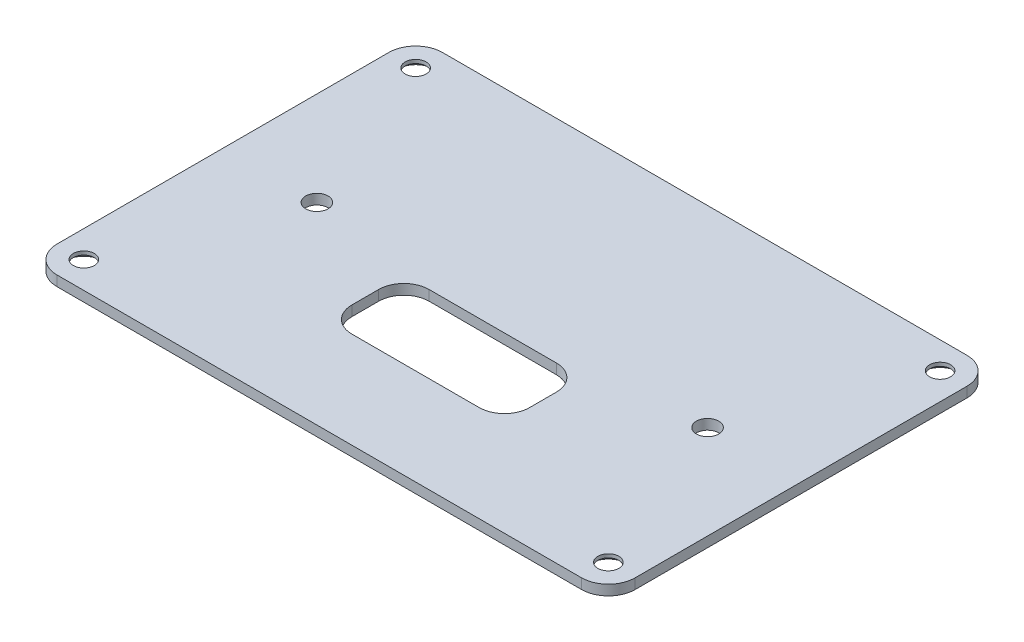
ISO-10303-21;
HEADER;
FILE_DESCRIPTION(('STEP AP214'),'2;1');
FILE_NAME('part.step','',(''),(''),'','','');
FILE_SCHEMA(('AUTOMOTIVE_DESIGN { 1 0 10303 214 1 1 1 1 }'));
ENDSEC;
DATA;
#1=APPLICATION_CONTEXT('core data for automotive mechanical design processes');
#2=APPLICATION_PROTOCOL_DEFINITION('international standard','automotive_design',2000,#1);
#3=PRODUCT_CONTEXT('',#1,'mechanical');
#4=PRODUCT('Part','Part','',(#3));
#5=PRODUCT_RELATED_PRODUCT_CATEGORY('part','',(#4));
#6=PRODUCT_DEFINITION_FORMATION('','',#4);
#7=PRODUCT_DEFINITION_CONTEXT('part definition',#1,'design');
#8=PRODUCT_DEFINITION('design','',#6,#7);
#9=PRODUCT_DEFINITION_SHAPE('','',#8);
#10=(LENGTH_UNIT() NAMED_UNIT(*) SI_UNIT(.MILLI.,.METRE.));
#11=(NAMED_UNIT(*) PLANE_ANGLE_UNIT() SI_UNIT($,.RADIAN.));
#12=(NAMED_UNIT(*) SI_UNIT($,.STERADIAN.) SOLID_ANGLE_UNIT());
#13=UNCERTAINTY_MEASURE_WITH_UNIT(LENGTH_MEASURE(1.E-05),#10,'distance_accuracy_value','');
#14=(GEOMETRIC_REPRESENTATION_CONTEXT(3) GLOBAL_UNCERTAINTY_ASSIGNED_CONTEXT((#13)) GLOBAL_UNIT_ASSIGNED_CONTEXT((#10,
#11,#12)) REPRESENTATION_CONTEXT('',''));
#15=CARTESIAN_POINT('',(0.,0.,0.));
#16=DIRECTION('',(0.,0.,1.));
#17=DIRECTION('',(1.,0.,0.));
#18=AXIS2_PLACEMENT_3D('',#15,#16,#17);
#19=CARTESIAN_POINT('',(-40.8250000000001,0.,-25.8250000000001));
#20=DIRECTION('',(0.,1.,0.));
#21=DIRECTION('',(0.,0.,1.));
#22=AXIS2_PLACEMENT_3D('',#19,#20,#21);
#23=PLANE('',#22);
#24=CARTESIAN_POINT('',(30.382,0.,-0.0614872263166575));
#25=DIRECTION('',(0.,-1.,0.));
#26=DIRECTION('',(0.,0.,-1.));
#27=AXIS2_PLACEMENT_3D('',#24,#25,#26);
#28=CIRCLE('',#27,1.7399);
#29=CARTESIAN_POINT('',(30.382,0.,-1.80138722631666));
#30=VERTEX_POINT('',#29);
#31=EDGE_CURVE('E568',#30,#30,#28,.T.);
#32=ORIENTED_EDGE('',*,*,#31,.F.);
#33=EDGE_LOOP('',(#32));
#34=FACE_BOUND('',#33,.T.);
#35=CARTESIAN_POINT('',(-30.3819999999999,0.,-0.00901752783329521));
#36=DIRECTION('',(0.,-1.,0.));
#37=DIRECTION('',(0.,0.,-1.));
#38=AXIS2_PLACEMENT_3D('',#35,#36,#37);
#39=CIRCLE('',#38,1.7399);
#40=CARTESIAN_POINT('',(-30.3819999999999,0.,-1.7489175278333));
#41=VERTEX_POINT('',#40);
#42=EDGE_CURVE('E570',#41,#41,#39,.T.);
#43=ORIENTED_EDGE('',*,*,#42,.F.);
#44=EDGE_LOOP('',(#43));
#45=FACE_BOUND('',#44,.T.);
#46=CARTESIAN_POINT('',(-40.8250000000001,0.,-25.8250000000001));
#47=DIRECTION('',(0.,-1.,0.));
#48=DIRECTION('',(0.,0.,-1.));
#49=AXIS2_PLACEMENT_3D('',#46,#47,#48);
#50=CIRCLE('',#49,2.8575);
#51=CARTESIAN_POINT('',(-40.8250000000001,0.,-28.6825000000001));
#52=VERTEX_POINT('',#51);
#53=EDGE_CURVE('E587',#52,#52,#50,.T.);
#54=ORIENTED_EDGE('',*,*,#53,.F.);
#55=EDGE_LOOP('',(#54));
#56=FACE_BOUND('',#55,.T.);
#57=CARTESIAN_POINT('',(-40.8250000000001,0.,-25.8250000000001));
#58=DIRECTION('',(0.,1.,0.));
#59=DIRECTION('',(0.,0.,1.));
#60=AXIS2_PLACEMENT_3D('',#57,#58,#59);
#61=CIRCLE('',#60,4.17499999999999);
#62=CARTESIAN_POINT('',(-40.8250000000001,0.,-30.0000000000001));
#63=VERTEX_POINT('',#62);
#64=CARTESIAN_POINT('',(-45.0000000000001,0.,-25.8250000000001));
#65=VERTEX_POINT('',#64);
#66=EDGE_CURVE('E367',#63,#65,#61,.T.);
#67=ORIENTED_EDGE('',*,*,#66,.F.);
#68=DIRECTION('',(-1.,0.,0.));
#69=VECTOR('',#68,1.);
#70=CARTESIAN_POINT('',(-40.8250000000001,0.,-30.0000000000001));
#71=LINE('',#70,#69);
#72=CARTESIAN_POINT('',(40.8250000000001,0.,-30.0000000000001));
#73=VERTEX_POINT('',#72);
#74=EDGE_CURVE('E383',#73,#63,#71,.T.);
#75=ORIENTED_EDGE('',*,*,#74,.F.);
#76=CARTESIAN_POINT('',(40.8250000000001,0.,-25.8250000000001));
#77=DIRECTION('',(0.,1.,0.));
#78=DIRECTION('',(0.,0.,1.));
#79=AXIS2_PLACEMENT_3D('',#76,#77,#78);
#80=CIRCLE('',#79,4.175);
#81=CARTESIAN_POINT('',(45.0000000000001,0.,-25.8250000000001));
#82=VERTEX_POINT('',#81);
#83=EDGE_CURVE('E410',#82,#73,#80,.T.);
#84=ORIENTED_EDGE('',*,*,#83,.F.);
#85=DIRECTION('',(0.,0.,-1.));
#86=VECTOR('',#85,1.);
#87=CARTESIAN_POINT('',(45.0000000000001,0.,-25.8250000000001));
#88=LINE('',#87,#86);
#89=CARTESIAN_POINT('',(45.0000000000001,0.,25.8250000000001));
#90=VERTEX_POINT('',#89);
#91=EDGE_CURVE('E408',#90,#82,#88,.T.);
#92=ORIENTED_EDGE('',*,*,#91,.F.);
#93=CARTESIAN_POINT('',(40.8250000000001,0.,25.8250000000001));
#94=DIRECTION('',(0.,1.,0.));
#95=DIRECTION('',(0.,0.,1.));
#96=AXIS2_PLACEMENT_3D('',#93,#94,#95);
#97=CIRCLE('',#96,4.17499999999999);
#98=CARTESIAN_POINT('',(40.8250000000001,0.,30.0000000000001));
#99=VERTEX_POINT('',#98);
#100=EDGE_CURVE('E406',#99,#90,#97,.T.);
#101=ORIENTED_EDGE('',*,*,#100,.F.);
#102=DIRECTION('',(1.,0.,0.));
#103=VECTOR('',#102,1.);
#104=CARTESIAN_POINT('',(-40.8250000000001,0.,30.0000000000001));
#105=LINE('',#104,#103);
#106=CARTESIAN_POINT('',(-40.8250000000001,0.,30.0000000000001));
#107=VERTEX_POINT('',#106);
#108=EDGE_CURVE('E404',#107,#99,#105,.T.);
#109=ORIENTED_EDGE('',*,*,#108,.F.);
#110=CARTESIAN_POINT('',(-40.8250000000001,0.,25.8250000000001));
#111=DIRECTION('',(0.,1.,0.));
#112=DIRECTION('',(0.,0.,1.));
#113=AXIS2_PLACEMENT_3D('',#110,#111,#112);
#114=CIRCLE('',#113,4.17500000000001);
#115=CARTESIAN_POINT('',(-45.0000000000001,0.,25.8250000000001));
#116=VERTEX_POINT('',#115);
#117=EDGE_CURVE('E402',#116,#107,#114,.T.);
#118=ORIENTED_EDGE('',*,*,#117,.F.);
#119=DIRECTION('',(0.,0.,1.));
#120=VECTOR('',#119,1.);
#121=CARTESIAN_POINT('',(-45.0000000000001,0.,-25.8250000000001));
#122=LINE('',#121,#120);
#123=EDGE_CURVE('E400',#65,#116,#122,.T.);
#124=ORIENTED_EDGE('',*,*,#123,.F.);
#125=EDGE_LOOP('',(#67,#75,#84,#92,#101,#109,#118,#124));
#126=FACE_BOUND('',#125,.T.);
#127=DIRECTION('',(1.,0.,0.));
#128=VECTOR('',#127,1.);
#129=CARTESIAN_POINT('',(-9.90599999792557,0.,2.99561449189324));
#130=LINE('',#129,#128);
#131=CARTESIAN_POINT('',(-9.90599999792557,0.,2.99561449189324));
#132=VERTEX_POINT('',#131);
#133=CARTESIAN_POINT('',(9.9059999999467,0.,2.9956144918925));
#134=VERTEX_POINT('',#133);
#135=EDGE_CURVE('E349',#132,#134,#130,.T.);
#136=ORIENTED_EDGE('',*,*,#135,.F.);
#137=CARTESIAN_POINT('',(-9.90600000000007,0.,6.92461449189326));
#138=DIRECTION('',(0.,-1.,0.));
#139=DIRECTION('',(0.,0.,-1.));
#140=AXIS2_PLACEMENT_3D('',#137,#138,#139);
#141=CIRCLE('',#140,3.929);
#142=CARTESIAN_POINT('',(-13.8350000000001,0.,6.92461449288326));
#143=VERTEX_POINT('',#142);
#144=EDGE_CURVE('E67',#143,#132,#141,.T.);
#145=ORIENTED_EDGE('',*,*,#144,.F.);
#146=DIRECTION('',(0.,0.,-1.));
#147=VECTOR('',#146,1.);
#148=CARTESIAN_POINT('',(-13.8350000000001,0.,6.92461449288326));
#149=LINE('',#148,#147);
#150=CARTESIAN_POINT('',(-13.8350000000001,0.,11.0902144916973));
#151=VERTEX_POINT('',#150);
#152=EDGE_CURVE('E176',#151,#143,#149,.T.);
#153=ORIENTED_EDGE('',*,*,#152,.F.);
#154=CARTESIAN_POINT('',(-9.90600000000007,0.,11.0902144918933));
#155=DIRECTION('',(0.,-1.,0.));
#156=DIRECTION('',(0.,0.,-1.));
#157=AXIS2_PLACEMENT_3D('',#154,#155,#156);
#158=CIRCLE('',#157,3.929);
#159=CARTESIAN_POINT('',(-9.90599999794791,0.,15.0192144918933));
#160=VERTEX_POINT('',#159);
#161=EDGE_CURVE('E179',#160,#151,#158,.T.);
#162=ORIENTED_EDGE('',*,*,#161,.F.);
#163=DIRECTION('',(-1.,0.,0.));
#164=VECTOR('',#163,1.);
#165=CARTESIAN_POINT('',(-9.90599999794791,0.,15.0192144918933));
#166=LINE('',#165,#164);
#167=CARTESIAN_POINT('',(9.905999999399,0.,15.0192144918933));
#168=VERTEX_POINT('',#167);
#169=EDGE_CURVE('E360',#168,#160,#166,.T.);
#170=ORIENTED_EDGE('',*,*,#169,.F.);
#171=CARTESIAN_POINT('',(9.90599999999999,0.,11.0902144918933));
#172=DIRECTION('',(0.,-1.,0.));
#173=DIRECTION('',(0.,0.,-1.));
#174=AXIS2_PLACEMENT_3D('',#171,#172,#173);
#175=CIRCLE('',#174,3.929);
#176=CARTESIAN_POINT('',(13.835,0.,11.0902144920402));
#177=VERTEX_POINT('',#176);
#178=EDGE_CURVE('E357',#177,#168,#175,.T.);
#179=ORIENTED_EDGE('',*,*,#178,.F.);
#180=DIRECTION('',(0.,0.,1.));
#181=VECTOR('',#180,1.);
#182=CARTESIAN_POINT('',(13.835,0.,6.9246144920885));
#183=LINE('',#182,#181);
#184=CARTESIAN_POINT('',(13.835,0.,6.9246144920885));
#185=VERTEX_POINT('',#184);
#186=EDGE_CURVE('E354',#185,#177,#183,.T.);
#187=ORIENTED_EDGE('',*,*,#186,.F.);
#188=CARTESIAN_POINT('',(9.90599999999999,0.,6.92461449189325));
#189=DIRECTION('',(0.,-1.,0.));
#190=DIRECTION('',(0.,0.,-1.));
#191=AXIS2_PLACEMENT_3D('',#188,#189,#190);
#192=CIRCLE('',#191,3.92900000000074);
#193=EDGE_CURVE('E351',#134,#185,#192,.T.);
#194=ORIENTED_EDGE('',*,*,#193,.F.);
#195=EDGE_LOOP('',(#136,#145,#153,#162,#170,#179,#187,#194));
#196=FACE_BOUND('',#195,.T.);
#197=CARTESIAN_POINT('',(40.8250000000001,0.,-25.8250000000001));
#198=DIRECTION('',(0.,-1.,0.));
#199=DIRECTION('',(0.,0.,-1.));
#200=AXIS2_PLACEMENT_3D('',#197,#198,#199);
#201=CIRCLE('',#200,2.8575);
#202=CARTESIAN_POINT('',(40.8250000000001,0.,-28.6825000000001));
#203=VERTEX_POINT('',#202);
#204=EDGE_CURVE('E605',#203,#203,#201,.T.);
#205=ORIENTED_EDGE('',*,*,#204,.F.);
#206=EDGE_LOOP('',(#205));
#207=FACE_BOUND('',#206,.T.);
#208=CARTESIAN_POINT('',(40.8250000000001,0.,25.8250000000001));
#209=DIRECTION('',(0.,-1.,0.));
#210=DIRECTION('',(0.,0.,-1.));
#211=AXIS2_PLACEMENT_3D('',#208,#209,#210);
#212=CIRCLE('',#211,2.8575);
#213=CARTESIAN_POINT('',(40.8250000000001,0.,22.9675000000001));
#214=VERTEX_POINT('',#213);
#215=EDGE_CURVE('E596',#214,#214,#212,.T.);
#216=ORIENTED_EDGE('',*,*,#215,.F.);
#217=EDGE_LOOP('',(#216));
#218=FACE_BOUND('',#217,.T.);
#219=CARTESIAN_POINT('',(-40.8250000000001,0.,25.8250000000001));
#220=DIRECTION('',(0.,-1.,0.));
#221=DIRECTION('',(0.,0.,-1.));
#222=AXIS2_PLACEMENT_3D('',#219,#220,#221);
#223=CIRCLE('',#222,2.8575);
#224=CARTESIAN_POINT('',(-40.8250000000001,0.,22.9675000000001));
#225=VERTEX_POINT('',#224);
#226=EDGE_CURVE('E576',#225,#225,#223,.T.);
#227=ORIENTED_EDGE('',*,*,#226,.F.);
#228=EDGE_LOOP('',(#227));
#229=FACE_BOUND('',#228,.T.);
#230=ADVANCED_FACE('F44',(#34,#45,#56,#126,#196,#207,#218,#229),#23,.F.);
#231=CARTESIAN_POINT('',(-40.8250000000001,1.5875,-25.8250000000001));
#232=DIRECTION('',(0.,1.,0.));
#233=DIRECTION('',(0.,0.,1.));
#234=AXIS2_PLACEMENT_3D('',#231,#232,#233);
#235=PLANE('',#234);
#236=CARTESIAN_POINT('',(30.382,1.5875,-0.0614872263166575));
#237=DIRECTION('',(0.,-1.,0.));
#238=DIRECTION('',(0.,0.,-1.));
#239=AXIS2_PLACEMENT_3D('',#236,#237,#238);
#240=CIRCLE('',#239,1.7399);
#241=CARTESIAN_POINT('',(30.382,1.5875,-1.80138722631666));
#242=VERTEX_POINT('',#241);
#243=EDGE_CURVE('E566',#242,#242,#240,.T.);
#244=ORIENTED_EDGE('',*,*,#243,.T.);
#245=EDGE_LOOP('',(#244));
#246=FACE_BOUND('',#245,.T.);
#247=CARTESIAN_POINT('',(-30.3819999999999,1.5875,-0.00901752783329521));
#248=DIRECTION('',(0.,-1.,0.));
#249=DIRECTION('',(0.,0.,-1.));
#250=AXIS2_PLACEMENT_3D('',#247,#248,#249);
#251=CIRCLE('',#250,1.7399);
#252=CARTESIAN_POINT('',(-30.3819999999999,1.5875,-1.7489175278333));
#253=VERTEX_POINT('',#252);
#254=EDGE_CURVE('E573',#253,#253,#251,.T.);
#255=ORIENTED_EDGE('',*,*,#254,.T.);
#256=EDGE_LOOP('',(#255));
#257=FACE_BOUND('',#256,.T.);
#258=CARTESIAN_POINT('',(-40.8250000000001,1.5875,-25.8250000000001));
#259=DIRECTION('',(0.,-1.,0.));
#260=DIRECTION('',(0.,0.,-1.));
#261=AXIS2_PLACEMENT_3D('',#258,#259,#260);
#262=CIRCLE('',#261,1.63195);
#263=CARTESIAN_POINT('',(-40.8250000000001,1.5875,-27.4569500000001));
#264=VERTEX_POINT('',#263);
#265=EDGE_CURVE('E593',#264,#264,#262,.T.);
#266=ORIENTED_EDGE('',*,*,#265,.T.);
#267=EDGE_LOOP('',(#266));
#268=FACE_BOUND('',#267,.T.);
#269=CARTESIAN_POINT('',(40.8250000000001,1.5875,-25.8250000000001));
#270=DIRECTION('',(0.,-1.,0.));
#271=DIRECTION('',(0.,0.,-1.));
#272=AXIS2_PLACEMENT_3D('',#269,#270,#271);
#273=CIRCLE('',#272,1.63195);
#274=CARTESIAN_POINT('',(40.8250000000001,1.5875,-27.4569500000001));
#275=VERTEX_POINT('',#274);
#276=EDGE_CURVE('E182',#275,#275,#273,.T.);
#277=ORIENTED_EDGE('',*,*,#276,.T.);
#278=EDGE_LOOP('',(#277));
#279=FACE_BOUND('',#278,.T.);
#280=CARTESIAN_POINT('',(-9.90600000000007,1.5875,6.92461449189326));
#281=DIRECTION('',(0.,-1.,0.));
#282=DIRECTION('',(0.,0.,-1.));
#283=AXIS2_PLACEMENT_3D('',#280,#281,#282);
#284=CIRCLE('',#283,3.929);
#285=CARTESIAN_POINT('',(-13.8350000000001,1.5875,6.92461449288326));
#286=VERTEX_POINT('',#285);
#287=CARTESIAN_POINT('',(-9.90599999792557,1.5875,2.99561449189324));
#288=VERTEX_POINT('',#287);
#289=EDGE_CURVE('E159',#286,#288,#284,.T.);
#290=ORIENTED_EDGE('',*,*,#289,.T.);
#291=DIRECTION('',(1.,0.,0.));
#292=VECTOR('',#291,1.);
#293=CARTESIAN_POINT('',(-9.90599999792557,1.5875,2.99561449189324));
#294=LINE('',#293,#292);
#295=CARTESIAN_POINT('',(9.9059999999467,1.5875,2.99561449189176));
#296=VERTEX_POINT('',#295);
#297=EDGE_CURVE('E168',#288,#296,#294,.T.);
#298=ORIENTED_EDGE('',*,*,#297,.T.);
#299=CARTESIAN_POINT('',(9.90599999999999,1.5875,6.92461449189325));
#300=DIRECTION('',(0.,-1.,0.));
#301=DIRECTION('',(0.,0.,-1.));
#302=AXIS2_PLACEMENT_3D('',#299,#300,#301);
#303=CIRCLE('',#302,3.92900000000074);
#304=CARTESIAN_POINT('',(13.835,1.5875,6.9246144920885));
#305=VERTEX_POINT('',#304);
#306=EDGE_CURVE('E59',#296,#305,#303,.T.);
#307=ORIENTED_EDGE('',*,*,#306,.T.);
#308=DIRECTION('',(0.,0.,1.));
#309=VECTOR('',#308,1.);
#310=CARTESIAN_POINT('',(13.835,1.5875,6.9246144920885));
#311=LINE('',#310,#309);
#312=CARTESIAN_POINT('',(13.835,1.5875,11.0902144920402));
#313=VERTEX_POINT('',#312);
#314=EDGE_CURVE('E186',#305,#313,#311,.T.);
#315=ORIENTED_EDGE('',*,*,#314,.T.);
#316=CARTESIAN_POINT('',(9.90599999999999,1.5875,11.0902144918933));
#317=DIRECTION('',(0.,-1.,0.));
#318=DIRECTION('',(0.,0.,-1.));
#319=AXIS2_PLACEMENT_3D('',#316,#317,#318);
#320=CIRCLE('',#319,3.929);
#321=CARTESIAN_POINT('',(9.905999999399,1.5875,15.0192144918933));
#322=VERTEX_POINT('',#321);
#323=EDGE_CURVE('E190',#313,#322,#320,.T.);
#324=ORIENTED_EDGE('',*,*,#323,.T.);
#325=DIRECTION('',(-1.,0.,0.));
#326=VECTOR('',#325,1.);
#327=CARTESIAN_POINT('',(-9.90599999794791,1.5875,15.0192144918933));
#328=LINE('',#327,#326);
#329=CARTESIAN_POINT('',(-9.90599999794791,1.5875,15.0192144918933));
#330=VERTEX_POINT('',#329);
#331=EDGE_CURVE('E342',#322,#330,#328,.T.);
#332=ORIENTED_EDGE('',*,*,#331,.T.);
#333=CARTESIAN_POINT('',(-9.90600000000007,1.5875,11.0902144918933));
#334=DIRECTION('',(0.,-1.,0.));
#335=DIRECTION('',(0.,0.,-1.));
#336=AXIS2_PLACEMENT_3D('',#333,#334,#335);
#337=CIRCLE('',#336,3.929);
#338=CARTESIAN_POINT('',(-13.8350000000001,1.5875,11.0902144916973));
#339=VERTEX_POINT('',#338);
#340=EDGE_CURVE('E345',#330,#339,#337,.T.);
#341=ORIENTED_EDGE('',*,*,#340,.T.);
#342=DIRECTION('',(0.,0.,-1.));
#343=VECTOR('',#342,1.);
#344=CARTESIAN_POINT('',(-13.8350000000001,1.5875,6.92461449288326));
#345=LINE('',#344,#343);
#346=EDGE_CURVE('E165',#339,#286,#345,.T.);
#347=ORIENTED_EDGE('',*,*,#346,.T.);
#348=EDGE_LOOP('',(#290,#298,#307,#315,#324,#332,#341,#347));
#349=FACE_BOUND('',#348,.T.);
#350=CARTESIAN_POINT('',(-40.8250000000001,1.5875,-25.8250000000001));
#351=DIRECTION('',(0.,1.,0.));
#352=DIRECTION('',(0.,0.,1.));
#353=AXIS2_PLACEMENT_3D('',#350,#351,#352);
#354=CIRCLE('',#353,4.17499999999999);
#355=CARTESIAN_POINT('',(-40.8250000000001,1.5875,-30.0000000000001));
#356=VERTEX_POINT('',#355);
#357=CARTESIAN_POINT('',(-45.0000000000001,1.5875,-25.8250000000001));
#358=VERTEX_POINT('',#357);
#359=EDGE_CURVE('E379',#356,#358,#354,.T.);
#360=ORIENTED_EDGE('',*,*,#359,.T.);
#361=DIRECTION('',(0.,0.,1.));
#362=VECTOR('',#361,1.);
#363=CARTESIAN_POINT('',(-45.0000000000001,1.5875,-25.8250000000001));
#364=LINE('',#363,#362);
#365=CARTESIAN_POINT('',(-45.0000000000001,1.5875,25.8250000000001));
#366=VERTEX_POINT('',#365);
#367=EDGE_CURVE('E382',#358,#366,#364,.T.);
#368=ORIENTED_EDGE('',*,*,#367,.T.);
#369=CARTESIAN_POINT('',(-40.8250000000001,1.5875,25.8250000000001));
#370=DIRECTION('',(0.,1.,0.));
#371=DIRECTION('',(0.,0.,1.));
#372=AXIS2_PLACEMENT_3D('',#369,#370,#371);
#373=CIRCLE('',#372,4.17500000000001);
#374=CARTESIAN_POINT('',(-40.8250000000001,1.5875,30.0000000000001));
#375=VERTEX_POINT('',#374);
#376=EDGE_CURVE('E385',#366,#375,#373,.T.);
#377=ORIENTED_EDGE('',*,*,#376,.T.);
#378=DIRECTION('',(1.,0.,0.));
#379=VECTOR('',#378,1.);
#380=CARTESIAN_POINT('',(-40.8250000000001,1.5875,30.0000000000001));
#381=LINE('',#380,#379);
#382=CARTESIAN_POINT('',(40.8250000000001,1.5875,30.0000000000001));
#383=VERTEX_POINT('',#382);
#384=EDGE_CURVE('E387',#375,#383,#381,.T.);
#385=ORIENTED_EDGE('',*,*,#384,.T.);
#386=CARTESIAN_POINT('',(40.8250000000001,1.5875,25.8250000000001));
#387=DIRECTION('',(0.,1.,0.));
#388=DIRECTION('',(0.,0.,1.));
#389=AXIS2_PLACEMENT_3D('',#386,#387,#388);
#390=CIRCLE('',#389,4.17499999999999);
#391=CARTESIAN_POINT('',(45.0000000000001,1.5875,25.8250000000001));
#392=VERTEX_POINT('',#391);
#393=EDGE_CURVE('E389',#383,#392,#390,.T.);
#394=ORIENTED_EDGE('',*,*,#393,.T.);
#395=DIRECTION('',(0.,0.,-1.));
#396=VECTOR('',#395,1.);
#397=CARTESIAN_POINT('',(45.0000000000001,1.5875,-25.8250000000001));
#398=LINE('',#397,#396);
#399=CARTESIAN_POINT('',(45.0000000000001,1.5875,-25.8250000000001));
#400=VERTEX_POINT('',#399);
#401=EDGE_CURVE('E391',#392,#400,#398,.T.);
#402=ORIENTED_EDGE('',*,*,#401,.T.);
#403=CARTESIAN_POINT('',(40.8250000000001,1.5875,-25.8250000000001));
#404=DIRECTION('',(0.,1.,0.));
#405=DIRECTION('',(0.,0.,1.));
#406=AXIS2_PLACEMENT_3D('',#403,#404,#405);
#407=CIRCLE('',#406,4.175);
#408=CARTESIAN_POINT('',(40.8250000000001,1.5875,-30.0000000000001));
#409=VERTEX_POINT('',#408);
#410=EDGE_CURVE('E393',#400,#409,#407,.T.);
#411=ORIENTED_EDGE('',*,*,#410,.T.);
#412=DIRECTION('',(-1.,0.,0.));
#413=VECTOR('',#412,1.);
#414=CARTESIAN_POINT('',(-40.8250000000001,1.5875,-30.0000000000001));
#415=LINE('',#414,#413);
#416=EDGE_CURVE('E395',#409,#356,#415,.T.);
#417=ORIENTED_EDGE('',*,*,#416,.T.);
#418=EDGE_LOOP('',(#360,#368,#377,#385,#394,#402,#411,#417));
#419=FACE_BOUND('',#418,.T.);
#420=CARTESIAN_POINT('',(40.8250000000001,1.5875,25.8250000000001));
#421=DIRECTION('',(0.,-1.,0.));
#422=DIRECTION('',(0.,0.,-1.));
#423=AXIS2_PLACEMENT_3D('',#420,#421,#422);
#424=CIRCLE('',#423,1.63195);
#425=CARTESIAN_POINT('',(40.8250000000001,1.5875,24.1930500000001));
#426=VERTEX_POINT('',#425);
#427=EDGE_CURVE('E602',#426,#426,#424,.T.);
#428=ORIENTED_EDGE('',*,*,#427,.T.);
#429=EDGE_LOOP('',(#428));
#430=FACE_BOUND('',#429,.T.);
#431=CARTESIAN_POINT('',(-40.8250000000001,1.5875,25.8250000000001));
#432=DIRECTION('',(0.,-1.,0.));
#433=DIRECTION('',(0.,0.,-1.));
#434=AXIS2_PLACEMENT_3D('',#431,#432,#433);
#435=CIRCLE('',#434,1.63195);
#436=CARTESIAN_POINT('',(-40.8250000000001,1.5875,24.1930500000001));
#437=VERTEX_POINT('',#436);
#438=EDGE_CURVE('E584',#437,#437,#435,.T.);
#439=ORIENTED_EDGE('',*,*,#438,.T.);
#440=EDGE_LOOP('',(#439));
#441=FACE_BOUND('',#440,.T.);
#442=ADVANCED_FACE('F172',(#246,#257,#268,#279,#349,#419,#430,#441),#235,.T.);
#443=CARTESIAN_POINT('',(-40.8250000000001,1.5875,-25.8250000000001));
#444=DIRECTION('',(0.,-1.,0.));
#445=DIRECTION('',(0.,0.,-1.));
#446=AXIS2_PLACEMENT_3D('',#443,#444,#445);
#447=CYLINDRICAL_SURFACE('',#446,4.17499999999999);
#448=ORIENTED_EDGE('',*,*,#66,.T.);
#449=DIRECTION('',(0.,-1.,0.));
#450=VECTOR('',#449,1.);
#451=CARTESIAN_POINT('',(-45.0000000000001,1.5875,-25.8250000000001));
#452=LINE('',#451,#450);
#453=EDGE_CURVE('E13',#358,#65,#452,.T.);
#454=ORIENTED_EDGE('',*,*,#453,.F.);
#455=ORIENTED_EDGE('',*,*,#359,.F.);
#456=DIRECTION('',(0.,-1.,0.));
#457=VECTOR('',#456,1.);
#458=CARTESIAN_POINT('',(-40.8250000000001,1.5875,-30.0000000000001));
#459=LINE('',#458,#457);
#460=EDGE_CURVE('E397',#356,#63,#459,.T.);
#461=ORIENTED_EDGE('',*,*,#460,.T.);
#462=EDGE_LOOP('',(#448,#454,#455,#461));
#463=FACE_BOUND('',#462,.T.);
#464=ADVANCED_FACE('F46',(#463),#447,.T.);
#465=CARTESIAN_POINT('',(-45.0000000000001,1.5875,-25.8250000000001));
#466=DIRECTION('',(1.,0.,0.));
#467=DIRECTION('',(0.,0.,-1.));
#468=AXIS2_PLACEMENT_3D('',#465,#466,#467);
#469=PLANE('',#468);
#470=ORIENTED_EDGE('',*,*,#123,.T.);
#471=DIRECTION('',(0.,-1.,0.));
#472=VECTOR('',#471,1.);
#473=CARTESIAN_POINT('',(-45.0000000000001,1.5875,25.8250000000001));
#474=LINE('',#473,#472);
#475=EDGE_CURVE('E52',#366,#116,#474,.T.);
#476=ORIENTED_EDGE('',*,*,#475,.F.);
#477=ORIENTED_EDGE('',*,*,#367,.F.);
#478=ORIENTED_EDGE('',*,*,#453,.T.);
#479=EDGE_LOOP('',(#470,#476,#477,#478));
#480=FACE_BOUND('',#479,.T.);
#481=ADVANCED_FACE('F456',(#480),#469,.F.);
#482=CARTESIAN_POINT('',(-40.8250000000001,1.5875,25.8250000000001));
#483=DIRECTION('',(0.,-1.,0.));
#484=DIRECTION('',(0.,0.,-1.));
#485=AXIS2_PLACEMENT_3D('',#482,#483,#484);
#486=CYLINDRICAL_SURFACE('',#485,4.17500000000001);
#487=ORIENTED_EDGE('',*,*,#117,.T.);
#488=DIRECTION('',(0.,-1.,0.));
#489=VECTOR('',#488,1.);
#490=CARTESIAN_POINT('',(-40.8250000000001,1.5875,30.0000000000001));
#491=LINE('',#490,#489);
#492=EDGE_CURVE('E427',#375,#107,#491,.T.);
#493=ORIENTED_EDGE('',*,*,#492,.F.);
#494=ORIENTED_EDGE('',*,*,#376,.F.);
#495=ORIENTED_EDGE('',*,*,#475,.T.);
#496=EDGE_LOOP('',(#487,#493,#494,#495));
#497=FACE_BOUND('',#496,.T.);
#498=ADVANCED_FACE('F434',(#497),#486,.T.);
#499=CARTESIAN_POINT('',(-40.8250000000001,1.5875,30.0000000000001));
#500=DIRECTION('',(0.,0.,-1.));
#501=DIRECTION('',(-1.,0.,0.));
#502=AXIS2_PLACEMENT_3D('',#499,#500,#501);
#503=PLANE('',#502);
#504=ORIENTED_EDGE('',*,*,#108,.T.);
#505=DIRECTION('',(0.,-1.,0.));
#506=VECTOR('',#505,1.);
#507=CARTESIAN_POINT('',(40.8250000000001,1.5875,30.0000000000001));
#508=LINE('',#507,#506);
#509=EDGE_CURVE('E424',#383,#99,#508,.T.);
#510=ORIENTED_EDGE('',*,*,#509,.F.);
#511=ORIENTED_EDGE('',*,*,#384,.F.);
#512=ORIENTED_EDGE('',*,*,#492,.T.);
#513=EDGE_LOOP('',(#504,#510,#511,#512));
#514=FACE_BOUND('',#513,.T.);
#515=ADVANCED_FACE('F445',(#514),#503,.F.);
#516=CARTESIAN_POINT('',(40.8250000000001,1.5875,25.8250000000001));
#517=DIRECTION('',(0.,-1.,0.));
#518=DIRECTION('',(0.,0.,-1.));
#519=AXIS2_PLACEMENT_3D('',#516,#517,#518);
#520=CYLINDRICAL_SURFACE('',#519,4.17499999999999);
#521=ORIENTED_EDGE('',*,*,#100,.T.);
#522=DIRECTION('',(0.,-1.,0.));
#523=VECTOR('',#522,1.);
#524=CARTESIAN_POINT('',(45.0000000000001,1.5875,25.8250000000001));
#525=LINE('',#524,#523);
#526=EDGE_CURVE('E421',#392,#90,#525,.T.);
#527=ORIENTED_EDGE('',*,*,#526,.F.);
#528=ORIENTED_EDGE('',*,*,#393,.F.);
#529=ORIENTED_EDGE('',*,*,#509,.T.);
#530=EDGE_LOOP('',(#521,#527,#528,#529));
#531=FACE_BOUND('',#530,.T.);
#532=ADVANCED_FACE('F449',(#531),#520,.T.);
#533=CARTESIAN_POINT('',(45.0000000000001,1.5875,-25.8250000000001));
#534=DIRECTION('',(-1.,0.,0.));
#535=DIRECTION('',(0.,0.,1.));
#536=AXIS2_PLACEMENT_3D('',#533,#534,#535);
#537=PLANE('',#536);
#538=ORIENTED_EDGE('',*,*,#91,.T.);
#539=DIRECTION('',(0.,-1.,0.));
#540=VECTOR('',#539,1.);
#541=CARTESIAN_POINT('',(45.0000000000001,1.5875,-25.8250000000001));
#542=LINE('',#541,#540);
#543=EDGE_CURVE('E418',#400,#82,#542,.T.);
#544=ORIENTED_EDGE('',*,*,#543,.F.);
#545=ORIENTED_EDGE('',*,*,#401,.F.);
#546=ORIENTED_EDGE('',*,*,#526,.T.);
#547=EDGE_LOOP('',(#538,#544,#545,#546));
#548=FACE_BOUND('',#547,.T.);
#549=ADVANCED_FACE('F469',(#548),#537,.F.);
#550=CARTESIAN_POINT('',(40.8250000000001,1.5875,-25.8250000000001));
#551=DIRECTION('',(0.,-1.,0.));
#552=DIRECTION('',(0.,0.,-1.));
#553=AXIS2_PLACEMENT_3D('',#550,#551,#552);
#554=CYLINDRICAL_SURFACE('',#553,4.175);
#555=ORIENTED_EDGE('',*,*,#83,.T.);
#556=DIRECTION('',(0.,-1.,0.));
#557=VECTOR('',#556,1.);
#558=CARTESIAN_POINT('',(40.8250000000001,1.5875,-30.0000000000001));
#559=LINE('',#558,#557);
#560=EDGE_CURVE('E415',#409,#73,#559,.T.);
#561=ORIENTED_EDGE('',*,*,#560,.F.);
#562=ORIENTED_EDGE('',*,*,#410,.F.);
#563=ORIENTED_EDGE('',*,*,#543,.T.);
#564=EDGE_LOOP('',(#555,#561,#562,#563));
#565=FACE_BOUND('',#564,.T.);
#566=ADVANCED_FACE('F467',(#565),#554,.T.);
#567=CARTESIAN_POINT('',(-40.8250000000001,1.5875,-30.0000000000001));
#568=DIRECTION('',(0.,0.,1.));
#569=DIRECTION('',(1.,0.,0.));
#570=AXIS2_PLACEMENT_3D('',#567,#568,#569);
#571=PLANE('',#570);
#572=ORIENTED_EDGE('',*,*,#74,.T.);
#573=ORIENTED_EDGE('',*,*,#460,.F.);
#574=ORIENTED_EDGE('',*,*,#416,.F.);
#575=ORIENTED_EDGE('',*,*,#560,.T.);
#576=EDGE_LOOP('',(#572,#573,#574,#575));
#577=FACE_BOUND('',#576,.T.);
#578=ADVANCED_FACE('F462',(#577),#571,.F.);
#579=CARTESIAN_POINT('',(-9.90600000000007,1.5875,6.92461449189326));
#580=DIRECTION('',(0.,-1.,0.));
#581=DIRECTION('',(0.,0.,-1.));
#582=AXIS2_PLACEMENT_3D('',#579,#580,#581);
#583=CYLINDRICAL_SURFACE('',#582,3.929);
#584=ORIENTED_EDGE('',*,*,#144,.T.);
#585=DIRECTION('',(0.,-1.,0.));
#586=VECTOR('',#585,1.);
#587=CARTESIAN_POINT('',(-9.90599999792557,1.5875,2.99561449189324));
#588=LINE('',#587,#586);
#589=EDGE_CURVE('E155',#288,#132,#588,.T.);
#590=ORIENTED_EDGE('',*,*,#589,.F.);
#591=ORIENTED_EDGE('',*,*,#289,.F.);
#592=DIRECTION('',(0.,-1.,0.));
#593=VECTOR('',#592,1.);
#594=CARTESIAN_POINT('',(-13.8350000000001,1.5875,6.92461449288326));
#595=LINE('',#594,#593);
#596=EDGE_CURVE('E365',#286,#143,#595,.T.);
#597=ORIENTED_EDGE('',*,*,#596,.T.);
#598=EDGE_LOOP('',(#584,#590,#591,#597));
#599=FACE_BOUND('',#598,.T.);
#600=ADVANCED_FACE('F157',(#599),#583,.F.);
#601=CARTESIAN_POINT('',(-13.8350000000001,1.5875,6.92461449288326));
#602=DIRECTION('',(-1.,0.,0.));
#603=DIRECTION('',(0.,0.,1.));
#604=AXIS2_PLACEMENT_3D('',#601,#602,#603);
#605=PLANE('',#604);
#606=ORIENTED_EDGE('',*,*,#152,.T.);
#607=ORIENTED_EDGE('',*,*,#596,.F.);
#608=ORIENTED_EDGE('',*,*,#346,.F.);
#609=DIRECTION('',(0.,-1.,0.));
#610=VECTOR('',#609,1.);
#611=CARTESIAN_POINT('',(-13.8350000000001,1.5875,11.0902144916973));
#612=LINE('',#611,#610);
#613=EDGE_CURVE('E368',#339,#151,#612,.T.);
#614=ORIENTED_EDGE('',*,*,#613,.T.);
#615=EDGE_LOOP('',(#606,#607,#608,#614));
#616=FACE_BOUND('',#615,.T.);
#617=ADVANCED_FACE('F494',(#616),#605,.F.);
#618=CARTESIAN_POINT('',(-9.90600000000007,1.5875,11.0902144918933));
#619=DIRECTION('',(0.,-1.,0.));
#620=DIRECTION('',(0.,0.,-1.));
#621=AXIS2_PLACEMENT_3D('',#618,#619,#620);
#622=CYLINDRICAL_SURFACE('',#621,3.929);
#623=ORIENTED_EDGE('',*,*,#161,.T.);
#624=ORIENTED_EDGE('',*,*,#613,.F.);
#625=ORIENTED_EDGE('',*,*,#340,.F.);
#626=DIRECTION('',(0.,-1.,0.));
#627=VECTOR('',#626,1.);
#628=CARTESIAN_POINT('',(-9.90599999794791,1.5875,15.0192144918933));
#629=LINE('',#628,#627);
#630=EDGE_CURVE('E370',#330,#160,#629,.T.);
#631=ORIENTED_EDGE('',*,*,#630,.T.);
#632=EDGE_LOOP('',(#623,#624,#625,#631));
#633=FACE_BOUND('',#632,.T.);
#634=ADVANCED_FACE('F498',(#633),#622,.F.);
#635=CARTESIAN_POINT('',(-9.90599999794791,1.5875,15.0192144918933));
#636=DIRECTION('',(0.,0.,1.));
#637=DIRECTION('',(1.,0.,0.));
#638=AXIS2_PLACEMENT_3D('',#635,#636,#637);
#639=PLANE('',#638);
#640=ORIENTED_EDGE('',*,*,#169,.T.);
#641=ORIENTED_EDGE('',*,*,#630,.F.);
#642=ORIENTED_EDGE('',*,*,#331,.F.);
#643=DIRECTION('',(0.,-1.,0.));
#644=VECTOR('',#643,1.);
#645=CARTESIAN_POINT('',(9.905999999399,1.5875,15.0192144918933));
#646=LINE('',#645,#644);
#647=EDGE_CURVE('E372',#322,#168,#646,.T.);
#648=ORIENTED_EDGE('',*,*,#647,.T.);
#649=EDGE_LOOP('',(#640,#641,#642,#648));
#650=FACE_BOUND('',#649,.T.);
#651=ADVANCED_FACE('F515',(#650),#639,.F.);
#652=CARTESIAN_POINT('',(9.90599999999999,1.5875,11.0902144918933));
#653=DIRECTION('',(0.,-1.,0.));
#654=DIRECTION('',(0.,0.,-1.));
#655=AXIS2_PLACEMENT_3D('',#652,#653,#654);
#656=CYLINDRICAL_SURFACE('',#655,3.929);
#657=ORIENTED_EDGE('',*,*,#178,.T.);
#658=ORIENTED_EDGE('',*,*,#647,.F.);
#659=ORIENTED_EDGE('',*,*,#323,.F.);
#660=DIRECTION('',(0.,-1.,0.));
#661=VECTOR('',#660,1.);
#662=CARTESIAN_POINT('',(13.835,1.5875,11.0902144920402));
#663=LINE('',#662,#661);
#664=EDGE_CURVE('E374',#313,#177,#663,.T.);
#665=ORIENTED_EDGE('',*,*,#664,.T.);
#666=EDGE_LOOP('',(#657,#658,#659,#665));
#667=FACE_BOUND('',#666,.T.);
#668=ADVANCED_FACE('F511',(#667),#656,.F.);
#669=CARTESIAN_POINT('',(13.835,1.5875,6.9246144920885));
#670=DIRECTION('',(1.,0.,0.));
#671=DIRECTION('',(0.,0.,-1.));
#672=AXIS2_PLACEMENT_3D('',#669,#670,#671);
#673=PLANE('',#672);
#674=ORIENTED_EDGE('',*,*,#186,.T.);
#675=ORIENTED_EDGE('',*,*,#664,.F.);
#676=ORIENTED_EDGE('',*,*,#314,.F.);
#677=DIRECTION('',(0.,-1.,0.));
#678=VECTOR('',#677,1.);
#679=CARTESIAN_POINT('',(13.835,1.5875,6.9246144920885));
#680=LINE('',#679,#678);
#681=EDGE_CURVE('E376',#305,#185,#680,.T.);
#682=ORIENTED_EDGE('',*,*,#681,.T.);
#683=EDGE_LOOP('',(#674,#675,#676,#682));
#684=FACE_BOUND('',#683,.T.);
#685=ADVANCED_FACE('F508',(#684),#673,.F.);
#686=CARTESIAN_POINT('',(9.90599999999999,1.5875,6.92461449189325));
#687=DIRECTION('',(0.,-1.,0.));
#688=DIRECTION('',(0.,0.,-1.));
#689=AXIS2_PLACEMENT_3D('',#686,#687,#688);
#690=CYLINDRICAL_SURFACE('',#689,3.92900000000074);
#691=ORIENTED_EDGE('',*,*,#193,.T.);
#692=ORIENTED_EDGE('',*,*,#681,.F.);
#693=ORIENTED_EDGE('',*,*,#306,.F.);
#694=DIRECTION('',(0.,-1.,0.));
#695=VECTOR('',#694,1.);
#696=CARTESIAN_POINT('',(9.9059999999467,1.5875,2.9956144918925));
#697=LINE('',#696,#695);
#698=EDGE_CURVE('E164',#296,#134,#697,.T.);
#699=ORIENTED_EDGE('',*,*,#698,.T.);
#700=EDGE_LOOP('',(#691,#692,#693,#699));
#701=FACE_BOUND('',#700,.T.);
#702=ADVANCED_FACE('F505',(#701),#690,.F.);
#703=CARTESIAN_POINT('',(-9.90599999792557,1.5875,2.99561449189324));
#704=DIRECTION('',(0.,0.,-1.));
#705=DIRECTION('',(-1.,0.,0.));
#706=AXIS2_PLACEMENT_3D('',#703,#704,#705);
#707=PLANE('',#706);
#708=ORIENTED_EDGE('',*,*,#135,.T.);
#709=ORIENTED_EDGE('',*,*,#698,.F.);
#710=ORIENTED_EDGE('',*,*,#297,.F.);
#711=ORIENTED_EDGE('',*,*,#589,.T.);
#712=EDGE_LOOP('',(#708,#709,#710,#711));
#713=FACE_BOUND('',#712,.T.);
#714=ADVANCED_FACE('F169',(#713),#707,.F.);
#715=CARTESIAN_POINT('',(40.8250000000001,0.,-25.8250000000001));
#716=DIRECTION('',(0.,-1.,0.));
#717=DIRECTION('',(0.,0.,-1.));
#718=AXIS2_PLACEMENT_3D('',#715,#716,#717);
#719=CYLINDRICAL_SURFACE('',#718,1.63194999999999);
#720=ORIENTED_EDGE('',*,*,#276,.F.);
#721=EDGE_LOOP('',(#720));
#722=FACE_BOUND('',#721,.T.);
#723=CARTESIAN_POINT('',(40.8250000000001,1.02835855298933,-25.8250000000001));
#724=DIRECTION('',(0.,-1.,0.));
#725=DIRECTION('',(0.,0.,-1.));
#726=AXIS2_PLACEMENT_3D('',#723,#724,#725);
#727=CIRCLE('',#726,1.63194999999999);
#728=CARTESIAN_POINT('',(40.8250000000001,1.02835855298933,-27.4569500000001));
#729=VERTEX_POINT('',#728);
#730=EDGE_CURVE('E607',#729,#729,#727,.T.);
#731=ORIENTED_EDGE('',*,*,#730,.T.);
#732=EDGE_LOOP('',(#731));
#733=FACE_BOUND('',#732,.T.);
#734=ADVANCED_FACE('F504',(#722,#733),#719,.F.);
#735=CARTESIAN_POINT('',(40.8250000000001,0.,-25.8250000000001));
#736=DIRECTION('',(0.,-1.,0.));
#737=DIRECTION('',(0.,0.,-1.));
#738=AXIS2_PLACEMENT_3D('',#735,#736,#737);
#739=CONICAL_SURFACE('',#738,2.8575,0.872664625997163);
#740=ORIENTED_EDGE('',*,*,#730,.F.);
#741=EDGE_LOOP('',(#740));
#742=FACE_BOUND('',#741,.T.);
#743=ORIENTED_EDGE('',*,*,#204,.T.);
#744=EDGE_LOOP('',(#743));
#745=FACE_BOUND('',#744,.T.);
#746=ADVANCED_FACE('F525',(#742,#745),#739,.F.);
#747=CARTESIAN_POINT('',(40.8250000000001,0.,25.8250000000001));
#748=DIRECTION('',(0.,-1.,0.));
#749=DIRECTION('',(0.,0.,-1.));
#750=AXIS2_PLACEMENT_3D('',#747,#748,#749);
#751=CYLINDRICAL_SURFACE('',#750,1.63194999999999);
#752=ORIENTED_EDGE('',*,*,#427,.F.);
#753=EDGE_LOOP('',(#752));
#754=FACE_BOUND('',#753,.T.);
#755=CARTESIAN_POINT('',(40.8250000000001,1.02835855298933,25.8250000000001));
#756=DIRECTION('',(0.,-1.,0.));
#757=DIRECTION('',(0.,0.,-1.));
#758=AXIS2_PLACEMENT_3D('',#755,#756,#757);
#759=CIRCLE('',#758,1.63194999999999);
#760=CARTESIAN_POINT('',(40.8250000000001,1.02835855298933,24.1930500000001));
#761=VERTEX_POINT('',#760);
#762=EDGE_CURVE('E599',#761,#761,#759,.T.);
#763=ORIENTED_EDGE('',*,*,#762,.T.);
#764=EDGE_LOOP('',(#763));
#765=FACE_BOUND('',#764,.T.);
#766=ADVANCED_FACE('F529',(#754,#765),#751,.F.);
#767=CARTESIAN_POINT('',(40.8250000000001,0.,25.8250000000001));
#768=DIRECTION('',(0.,-1.,0.));
#769=DIRECTION('',(0.,0.,-1.));
#770=AXIS2_PLACEMENT_3D('',#767,#768,#769);
#771=CONICAL_SURFACE('',#770,2.8575,0.872664625997163);
#772=ORIENTED_EDGE('',*,*,#762,.F.);
#773=EDGE_LOOP('',(#772));
#774=FACE_BOUND('',#773,.T.);
#775=ORIENTED_EDGE('',*,*,#215,.T.);
#776=EDGE_LOOP('',(#775));
#777=FACE_BOUND('',#776,.T.);
#778=ADVANCED_FACE('F533',(#774,#777),#771,.F.);
#779=CARTESIAN_POINT('',(-40.8250000000001,0.,-25.8250000000001));
#780=DIRECTION('',(0.,-1.,0.));
#781=DIRECTION('',(0.,0.,-1.));
#782=AXIS2_PLACEMENT_3D('',#779,#780,#781);
#783=CYLINDRICAL_SURFACE('',#782,1.63194999999999);
#784=ORIENTED_EDGE('',*,*,#265,.F.);
#785=EDGE_LOOP('',(#784));
#786=FACE_BOUND('',#785,.T.);
#787=CARTESIAN_POINT('',(-40.8250000000001,1.02835855298933,-25.8250000000001));
#788=DIRECTION('',(0.,-1.,0.));
#789=DIRECTION('',(0.,0.,-1.));
#790=AXIS2_PLACEMENT_3D('',#787,#788,#789);
#791=CIRCLE('',#790,1.63194999999999);
#792=CARTESIAN_POINT('',(-40.8250000000001,1.02835855298933,-27.4569500000001));
#793=VERTEX_POINT('',#792);
#794=EDGE_CURVE('E590',#793,#793,#791,.T.);
#795=ORIENTED_EDGE('',*,*,#794,.T.);
#796=EDGE_LOOP('',(#795));
#797=FACE_BOUND('',#796,.T.);
#798=ADVANCED_FACE('F537',(#786,#797),#783,.F.);
#799=CARTESIAN_POINT('',(-40.8250000000001,0.,-25.8250000000001));
#800=DIRECTION('',(0.,-1.,0.));
#801=DIRECTION('',(0.,0.,-1.));
#802=AXIS2_PLACEMENT_3D('',#799,#800,#801);
#803=CONICAL_SURFACE('',#802,2.8575,0.872664625997163);
#804=ORIENTED_EDGE('',*,*,#794,.F.);
#805=EDGE_LOOP('',(#804));
#806=FACE_BOUND('',#805,.T.);
#807=ORIENTED_EDGE('',*,*,#53,.T.);
#808=EDGE_LOOP('',(#807));
#809=FACE_BOUND('',#808,.T.);
#810=ADVANCED_FACE('F541',(#806,#809),#803,.F.);
#811=CARTESIAN_POINT('',(-40.8250000000001,0.,25.8250000000001));
#812=DIRECTION('',(0.,-1.,0.));
#813=DIRECTION('',(0.,0.,-1.));
#814=AXIS2_PLACEMENT_3D('',#811,#812,#813);
#815=CYLINDRICAL_SURFACE('',#814,1.63194999999999);
#816=ORIENTED_EDGE('',*,*,#438,.F.);
#817=EDGE_LOOP('',(#816));
#818=FACE_BOUND('',#817,.T.);
#819=CARTESIAN_POINT('',(-40.8250000000001,1.02835855298933,25.8250000000001));
#820=DIRECTION('',(0.,-1.,0.));
#821=DIRECTION('',(0.,0.,-1.));
#822=AXIS2_PLACEMENT_3D('',#819,#820,#821);
#823=CIRCLE('',#822,1.63194999999999);
#824=CARTESIAN_POINT('',(-40.8250000000001,1.02835855298933,24.1930500000001));
#825=VERTEX_POINT('',#824);
#826=EDGE_CURVE('E581',#825,#825,#823,.T.);
#827=ORIENTED_EDGE('',*,*,#826,.T.);
#828=EDGE_LOOP('',(#827));
#829=FACE_BOUND('',#828,.T.);
#830=ADVANCED_FACE('F545',(#818,#829),#815,.F.);
#831=CARTESIAN_POINT('',(-40.8250000000001,0.,25.8250000000001));
#832=DIRECTION('',(0.,-1.,0.));
#833=DIRECTION('',(0.,0.,-1.));
#834=AXIS2_PLACEMENT_3D('',#831,#832,#833);
#835=CONICAL_SURFACE('',#834,2.8575,0.872664625997163);
#836=ORIENTED_EDGE('',*,*,#826,.F.);
#837=EDGE_LOOP('',(#836));
#838=FACE_BOUND('',#837,.T.);
#839=ORIENTED_EDGE('',*,*,#226,.T.);
#840=EDGE_LOOP('',(#839));
#841=FACE_BOUND('',#840,.T.);
#842=ADVANCED_FACE('F549',(#838,#841),#835,.F.);
#843=CARTESIAN_POINT('',(-30.3819999999999,1.5875,-0.00901752783329521));
#844=DIRECTION('',(0.,-1.,0.));
#845=DIRECTION('',(0.,0.,-1.));
#846=AXIS2_PLACEMENT_3D('',#843,#844,#845);
#847=CYLINDRICAL_SURFACE('',#846,1.7399);
#848=ORIENTED_EDGE('',*,*,#254,.F.);
#849=EDGE_LOOP('',(#848));
#850=FACE_BOUND('',#849,.T.);
#851=ORIENTED_EDGE('',*,*,#42,.T.);
#852=EDGE_LOOP('',(#851));
#853=FACE_BOUND('',#852,.T.);
#854=ADVANCED_FACE('F553',(#850,#853),#847,.F.);
#855=CARTESIAN_POINT('',(30.382,1.5875,-0.0614872263166575));
#856=DIRECTION('',(0.,-1.,0.));
#857=DIRECTION('',(0.,0.,-1.));
#858=AXIS2_PLACEMENT_3D('',#855,#856,#857);
#859=CYLINDRICAL_SURFACE('',#858,1.7399);
#860=ORIENTED_EDGE('',*,*,#243,.F.);
#861=EDGE_LOOP('',(#860));
#862=FACE_BOUND('',#861,.T.);
#863=ORIENTED_EDGE('',*,*,#31,.T.);
#864=EDGE_LOOP('',(#863));
#865=FACE_BOUND('',#864,.T.);
#866=ADVANCED_FACE('F557',(#862,#865),#859,.F.);
#867=CLOSED_SHELL('',(#230,#442,#464,#481,#498,#515,#532,#549,#566,#578,#600,#617,#634,#651,
#668,#685,#702,#714,#734,#746,#766,#778,#798,#810,#830,#842,#854,#866));
#868=MANIFOLD_SOLID_BREP('B2',#867);
#869=ADVANCED_BREP_SHAPE_REPRESENTATION('',(#18,#868),#14);
#870=SHAPE_DEFINITION_REPRESENTATION(#9,#869);
ENDSEC;
END-ISO-10303-21;
